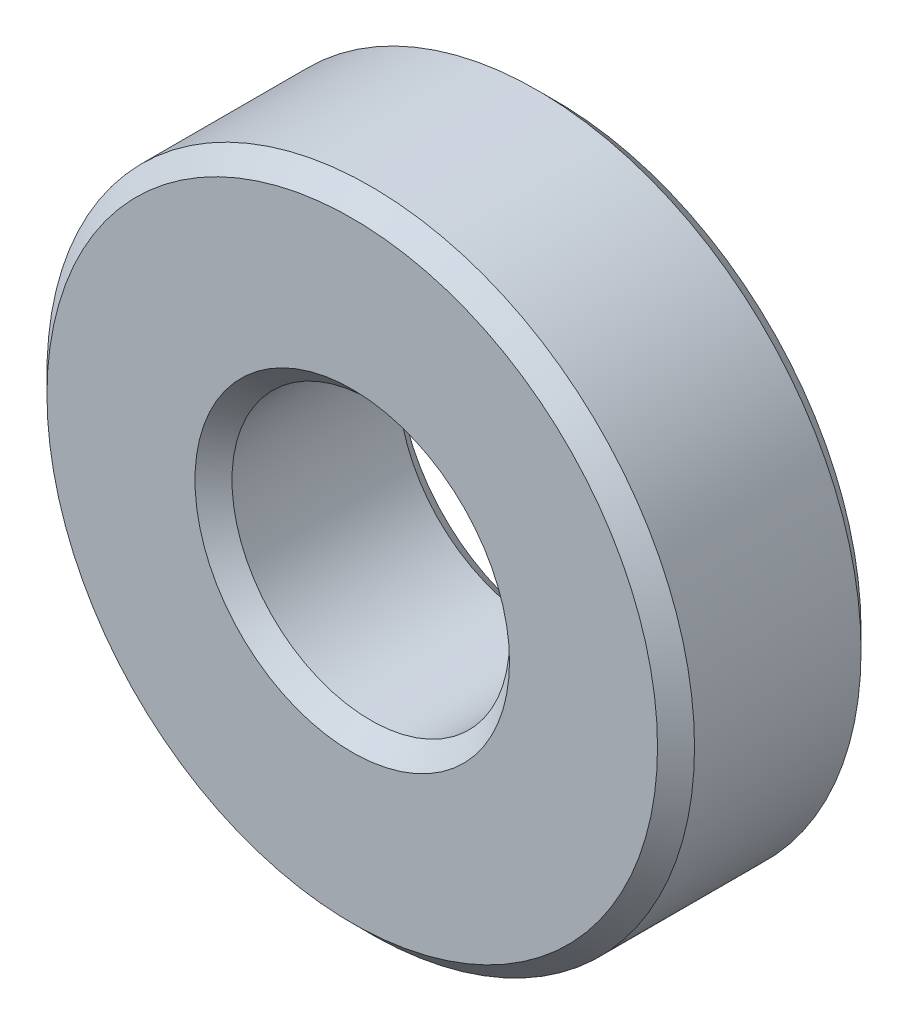
ISO-10303-21;
HEADER;
FILE_DESCRIPTION(('STEP AP214'),'2;1');
FILE_NAME('part.step','',(''),(''),'','','');
FILE_SCHEMA(('AUTOMOTIVE_DESIGN { 1 0 10303 214 1 1 1 1 }'));
ENDSEC;
DATA;
#1=APPLICATION_CONTEXT('core data for automotive mechanical design processes');
#2=APPLICATION_PROTOCOL_DEFINITION('international standard','automotive_design',2000,#1);
#3=PRODUCT_CONTEXT('',#1,'mechanical');
#4=PRODUCT('Part','Part','',(#3));
#5=PRODUCT_RELATED_PRODUCT_CATEGORY('part','',(#4));
#6=PRODUCT_DEFINITION_FORMATION('','',#4);
#7=PRODUCT_DEFINITION_CONTEXT('part definition',#1,'design');
#8=PRODUCT_DEFINITION('design','',#6,#7);
#9=PRODUCT_DEFINITION_SHAPE('','',#8);
#10=(LENGTH_UNIT() NAMED_UNIT(*) SI_UNIT(.MILLI.,.METRE.));
#11=(NAMED_UNIT(*) PLANE_ANGLE_UNIT() SI_UNIT($,.RADIAN.));
#12=(NAMED_UNIT(*) SI_UNIT($,.STERADIAN.) SOLID_ANGLE_UNIT());
#13=UNCERTAINTY_MEASURE_WITH_UNIT(LENGTH_MEASURE(1.E-05),#10,'distance_accuracy_value','');
#14=(GEOMETRIC_REPRESENTATION_CONTEXT(3) GLOBAL_UNCERTAINTY_ASSIGNED_CONTEXT((#13)) GLOBAL_UNIT_ASSIGNED_CONTEXT((#10,
#11,#12)) REPRESENTATION_CONTEXT('',''));
#15=CARTESIAN_POINT('',(0.,0.,0.));
#16=DIRECTION('',(0.,0.,1.));
#17=DIRECTION('',(1.,0.,0.));
#18=AXIS2_PLACEMENT_3D('',#15,#16,#17);
#19=CARTESIAN_POINT('',(0.,0.,11.));
#20=DIRECTION('',(0.,0.,1.));
#21=DIRECTION('',(1.,0.,0.));
#22=AXIS2_PLACEMENT_3D('',#19,#20,#21);
#23=PLANE('',#22);
#24=CARTESIAN_POINT('',(0.,0.,11.));
#25=DIRECTION('',(0.,0.,1.));
#26=DIRECTION('',(1.,0.,0.));
#27=AXIS2_PLACEMENT_3D('',#24,#25,#26);
#28=CIRCLE('',#27,8.50000000000001);
#29=CARTESIAN_POINT('',(8.50000000000001,0.,11.));
#30=VERTEX_POINT('',#29);
#31=EDGE_CURVE('E10',#30,#30,#28,.F.);
#32=ORIENTED_EDGE('',*,*,#31,.T.);
#33=EDGE_LOOP('',(#32));
#34=FACE_BOUND('',#33,.T.);
#35=CARTESIAN_POINT('',(0.,0.,11.));
#36=DIRECTION('',(0.,0.,1.));
#37=DIRECTION('',(1.,0.,0.));
#38=AXIS2_PLACEMENT_3D('',#35,#36,#37);
#39=CIRCLE('',#38,16.5);
#40=CARTESIAN_POINT('',(16.5,0.,11.));
#41=VERTEX_POINT('',#40);
#42=EDGE_CURVE('E46',#41,#41,#39,.T.);
#43=ORIENTED_EDGE('',*,*,#42,.T.);
#44=EDGE_LOOP('',(#43));
#45=FACE_BOUND('',#44,.T.);
#46=ADVANCED_FACE('F38',(#34,#45),#23,.T.);
#47=CARTESIAN_POINT('',(0.,0.,0.));
#48=DIRECTION('',(0.,0.,1.));
#49=DIRECTION('',(1.,0.,0.));
#50=AXIS2_PLACEMENT_3D('',#47,#48,#49);
#51=PLANE('',#50);
#52=CARTESIAN_POINT('',(0.,0.,0.));
#53=DIRECTION('',(0.,0.,1.));
#54=DIRECTION('',(1.,0.,0.));
#55=AXIS2_PLACEMENT_3D('',#52,#53,#54);
#56=CIRCLE('',#55,8.5);
#57=CARTESIAN_POINT('',(8.5,0.,0.));
#58=VERTEX_POINT('',#57);
#59=EDGE_CURVE('E65',#58,#58,#56,.T.);
#60=ORIENTED_EDGE('',*,*,#59,.T.);
#61=EDGE_LOOP('',(#60));
#62=FACE_BOUND('',#61,.T.);
#63=CARTESIAN_POINT('',(0.,0.,0.));
#64=DIRECTION('',(0.,0.,1.));
#65=DIRECTION('',(1.,0.,0.));
#66=AXIS2_PLACEMENT_3D('',#63,#64,#65);
#67=CIRCLE('',#66,16.5);
#68=CARTESIAN_POINT('',(16.5,0.,0.));
#69=VERTEX_POINT('',#68);
#70=EDGE_CURVE('E68',#69,#69,#67,.F.);
#71=ORIENTED_EDGE('',*,*,#70,.T.);
#72=EDGE_LOOP('',(#71));
#73=FACE_BOUND('',#72,.T.);
#74=ADVANCED_FACE('F72',(#62,#73),#51,.F.);
#75=CARTESIAN_POINT('',(0.,0.,11.));
#76=DIRECTION('',(0.,0.,-1.));
#77=DIRECTION('',(-1.,0.,0.));
#78=AXIS2_PLACEMENT_3D('',#75,#76,#77);
#79=CYLINDRICAL_SURFACE('',#78,17.5);
#80=CARTESIAN_POINT('',(0.,0.,1.));
#81=DIRECTION('',(0.,0.,1.));
#82=DIRECTION('',(1.,0.,0.));
#83=AXIS2_PLACEMENT_3D('',#80,#81,#82);
#84=CIRCLE('',#83,17.5);
#85=CARTESIAN_POINT('',(17.5,0.,1.));
#86=VERTEX_POINT('',#85);
#87=EDGE_CURVE('E50',#86,#86,#84,.T.);
#88=ORIENTED_EDGE('',*,*,#87,.T.);
#89=EDGE_LOOP('',(#88));
#90=FACE_BOUND('',#89,.T.);
#91=CARTESIAN_POINT('',(0.,0.,9.99999999999999));
#92=DIRECTION('',(0.,0.,1.));
#93=DIRECTION('',(1.,0.,0.));
#94=AXIS2_PLACEMENT_3D('',#91,#92,#93);
#95=CIRCLE('',#94,17.5);
#96=CARTESIAN_POINT('',(17.5,0.,9.99999999999999));
#97=VERTEX_POINT('',#96);
#98=EDGE_CURVE('E54',#97,#97,#95,.F.);
#99=ORIENTED_EDGE('',*,*,#98,.T.);
#100=EDGE_LOOP('',(#99));
#101=FACE_BOUND('',#100,.T.);
#102=ADVANCED_FACE('F82',(#90,#101),#79,.T.);
#103=CARTESIAN_POINT('',(0.,0.,11.));
#104=DIRECTION('',(0.,0.,-1.));
#105=DIRECTION('',(-1.,0.,0.));
#106=AXIS2_PLACEMENT_3D('',#103,#104,#105);
#107=CYLINDRICAL_SURFACE('',#106,7.5);
#108=CARTESIAN_POINT('',(0.,0.,0.999999999999999));
#109=DIRECTION('',(0.,0.,1.));
#110=DIRECTION('',(1.,0.,0.));
#111=AXIS2_PLACEMENT_3D('',#108,#109,#110);
#112=CIRCLE('',#111,7.5);
#113=CARTESIAN_POINT('',(7.5,0.,0.999999999999999));
#114=VERTEX_POINT('',#113);
#115=EDGE_CURVE('E59',#114,#114,#112,.F.);
#116=ORIENTED_EDGE('',*,*,#115,.T.);
#117=EDGE_LOOP('',(#116));
#118=FACE_BOUND('',#117,.T.);
#119=CARTESIAN_POINT('',(0.,0.,9.99999999999999));
#120=DIRECTION('',(0.,0.,1.));
#121=DIRECTION('',(1.,0.,0.));
#122=AXIS2_PLACEMENT_3D('',#119,#120,#121);
#123=CIRCLE('',#122,7.5);
#124=CARTESIAN_POINT('',(7.5,0.,9.99999999999999));
#125=VERTEX_POINT('',#124);
#126=EDGE_CURVE('E62',#125,#125,#123,.T.);
#127=ORIENTED_EDGE('',*,*,#126,.T.);
#128=EDGE_LOOP('',(#127));
#129=FACE_BOUND('',#128,.T.);
#130=ADVANCED_FACE('F85',(#118,#129),#107,.F.);
#131=CARTESIAN_POINT('',(0.,0.,0.));
#132=DIRECTION('',(0.,0.,-1.));
#133=DIRECTION('',(-1.,0.,0.));
#134=AXIS2_PLACEMENT_3D('',#131,#132,#133);
#135=CONICAL_SURFACE('',#134,8.5,0.785398163397447);
#136=ORIENTED_EDGE('',*,*,#115,.F.);
#137=EDGE_LOOP('',(#136));
#138=FACE_BOUND('',#137,.T.);
#139=ORIENTED_EDGE('',*,*,#59,.F.);
#140=EDGE_LOOP('',(#139));
#141=FACE_BOUND('',#140,.T.);
#142=ADVANCED_FACE('F78',(#138,#141),#135,.F.);
#143=CARTESIAN_POINT('',(0.,0.,1.));
#144=DIRECTION('',(0.,0.,1.));
#145=DIRECTION('',(1.,0.,0.));
#146=AXIS2_PLACEMENT_3D('',#143,#144,#145);
#147=CONICAL_SURFACE('',#146,17.5,0.78539816339745);
#148=ORIENTED_EDGE('',*,*,#70,.F.);
#149=EDGE_LOOP('',(#148));
#150=FACE_BOUND('',#149,.T.);
#151=ORIENTED_EDGE('',*,*,#87,.F.);
#152=EDGE_LOOP('',(#151));
#153=FACE_BOUND('',#152,.T.);
#154=ADVANCED_FACE('F74',(#150,#153),#147,.T.);
#155=CARTESIAN_POINT('',(0.,0.,9.99999999999999));
#156=DIRECTION('',(0.,0.,1.));
#157=DIRECTION('',(1.,0.,0.));
#158=AXIS2_PLACEMENT_3D('',#155,#156,#157);
#159=CONICAL_SURFACE('',#158,7.5,0.785398163397448);
#160=ORIENTED_EDGE('',*,*,#31,.F.);
#161=EDGE_LOOP('',(#160));
#162=FACE_BOUND('',#161,.T.);
#163=ORIENTED_EDGE('',*,*,#126,.F.);
#164=EDGE_LOOP('',(#163));
#165=FACE_BOUND('',#164,.T.);
#166=ADVANCED_FACE('F77',(#162,#165),#159,.F.);
#167=CARTESIAN_POINT('',(0.,0.,11.));
#168=DIRECTION('',(0.,0.,-1.));
#169=DIRECTION('',(-1.,0.,0.));
#170=AXIS2_PLACEMENT_3D('',#167,#168,#169);
#171=CONICAL_SURFACE('',#170,16.5,0.78539816339745);
#172=ORIENTED_EDGE('',*,*,#98,.F.);
#173=EDGE_LOOP('',(#172));
#174=FACE_BOUND('',#173,.T.);
#175=ORIENTED_EDGE('',*,*,#42,.F.);
#176=EDGE_LOOP('',(#175));
#177=FACE_BOUND('',#176,.T.);
#178=ADVANCED_FACE('F41',(#174,#177),#171,.T.);
#179=CLOSED_SHELL('',(#46,#74,#102,#130,#142,#154,#166,#178));
#180=MANIFOLD_SOLID_BREP('B2',#179);
#181=ADVANCED_BREP_SHAPE_REPRESENTATION('',(#18,#180),#14);
#182=SHAPE_DEFINITION_REPRESENTATION(#9,#181);
ENDSEC;
END-ISO-10303-21;
